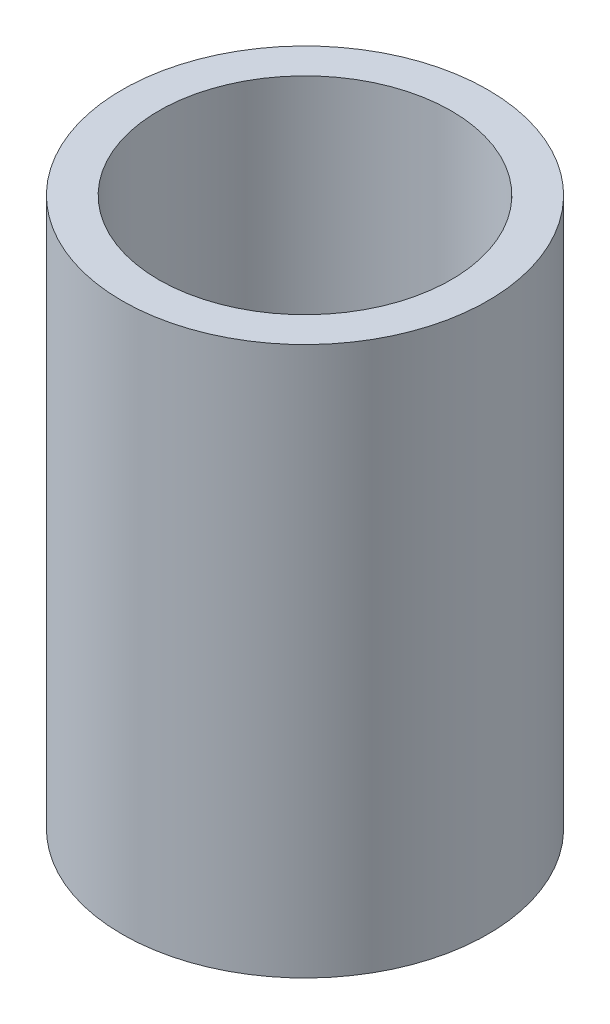
ISO-10303-21;
HEADER;
FILE_DESCRIPTION(('STEP AP214'),'2;1');
FILE_NAME('part.step','',(''),(''),'','','');
FILE_SCHEMA(('AUTOMOTIVE_DESIGN { 1 0 10303 214 1 1 1 1 }'));
ENDSEC;
DATA;
#1=APPLICATION_CONTEXT('core data for automotive mechanical design processes');
#2=APPLICATION_PROTOCOL_DEFINITION('international standard','automotive_design',2000,#1);
#3=PRODUCT_CONTEXT('',#1,'mechanical');
#4=PRODUCT('Part','Part','',(#3));
#5=PRODUCT_RELATED_PRODUCT_CATEGORY('part','',(#4));
#6=PRODUCT_DEFINITION_FORMATION('','',#4);
#7=PRODUCT_DEFINITION_CONTEXT('part definition',#1,'design');
#8=PRODUCT_DEFINITION('design','',#6,#7);
#9=PRODUCT_DEFINITION_SHAPE('','',#8);
#10=(LENGTH_UNIT() NAMED_UNIT(*) SI_UNIT(.MILLI.,.METRE.));
#11=(NAMED_UNIT(*) PLANE_ANGLE_UNIT() SI_UNIT($,.RADIAN.));
#12=(NAMED_UNIT(*) SI_UNIT($,.STERADIAN.) SOLID_ANGLE_UNIT());
#13=UNCERTAINTY_MEASURE_WITH_UNIT(LENGTH_MEASURE(1.E-05),#10,'distance_accuracy_value','');
#14=(GEOMETRIC_REPRESENTATION_CONTEXT(3) GLOBAL_UNCERTAINTY_ASSIGNED_CONTEXT((#13)) GLOBAL_UNIT_ASSIGNED_CONTEXT((#10,
#11,#12)) REPRESENTATION_CONTEXT('',''));
#15=CARTESIAN_POINT('',(0.,0.,0.));
#16=DIRECTION('',(0.,0.,1.));
#17=DIRECTION('',(1.,0.,0.));
#18=AXIS2_PLACEMENT_3D('',#15,#16,#17);
#19=CARTESIAN_POINT('',(0.,150.,0.));
#20=DIRECTION('',(0.,-1.,0.));
#21=DIRECTION('',(0.,0.,-1.));
#22=AXIS2_PLACEMENT_3D('',#19,#20,#21);
#23=CYLINDRICAL_SURFACE('',#22,40.);
#24=CARTESIAN_POINT('',(0.,150.,0.));
#25=DIRECTION('',(0.,1.,0.));
#26=DIRECTION('',(0.,0.,1.));
#27=AXIS2_PLACEMENT_3D('',#24,#25,#26);
#28=CIRCLE('',#27,40.);
#29=CARTESIAN_POINT('',(0.,150.,40.));
#30=VERTEX_POINT('',#29);
#31=EDGE_CURVE('E50',#30,#30,#28,.T.);
#32=ORIENTED_EDGE('',*,*,#31,.T.);
#33=EDGE_LOOP('',(#32));
#34=FACE_BOUND('',#33,.T.);
#35=CARTESIAN_POINT('',(0.,10.,0.));
#36=DIRECTION('',(0.,-1.,0.));
#37=DIRECTION('',(0.,0.,-1.));
#38=AXIS2_PLACEMENT_3D('',#35,#36,#37);
#39=CIRCLE('',#38,40.);
#40=CARTESIAN_POINT('',(0.,10.,-40.));
#41=VERTEX_POINT('',#40);
#42=EDGE_CURVE('E54',#41,#41,#39,.F.);
#43=ORIENTED_EDGE('',*,*,#42,.F.);
#44=EDGE_LOOP('',(#43));
#45=FACE_BOUND('',#44,.T.);
#46=ADVANCED_FACE('F39',(#34,#45),#23,.F.);
#47=CARTESIAN_POINT('',(0.,150.,0.));
#48=DIRECTION('',(0.,1.,0.));
#49=DIRECTION('',(0.,0.,1.));
#50=AXIS2_PLACEMENT_3D('',#47,#48,#49);
#51=PLANE('',#50);
#52=CARTESIAN_POINT('',(0.,150.,0.));
#53=DIRECTION('',(0.,1.,0.));
#54=DIRECTION('',(0.,0.,1.));
#55=AXIS2_PLACEMENT_3D('',#52,#53,#54);
#56=CIRCLE('',#55,50.);
#57=CARTESIAN_POINT('',(0.,150.,50.));
#58=VERTEX_POINT('',#57);
#59=EDGE_CURVE('E10',#58,#58,#56,.T.);
#60=ORIENTED_EDGE('',*,*,#59,.T.);
#61=EDGE_LOOP('',(#60));
#62=FACE_BOUND('',#61,.T.);
#63=ORIENTED_EDGE('',*,*,#31,.F.);
#64=EDGE_LOOP('',(#63));
#65=FACE_BOUND('',#64,.T.);
#66=ADVANCED_FACE('F75',(#62,#65),#51,.T.);
#67=CARTESIAN_POINT('',(0.,0.,0.));
#68=DIRECTION('',(0.,1.,0.));
#69=DIRECTION('',(0.,0.,1.));
#70=AXIS2_PLACEMENT_3D('',#67,#68,#69);
#71=PLANE('',#70);
#72=CARTESIAN_POINT('',(0.,0.,0.));
#73=DIRECTION('',(0.,1.,0.));
#74=DIRECTION('',(0.,0.,1.));
#75=AXIS2_PLACEMENT_3D('',#72,#73,#74);
#76=CIRCLE('',#75,50.);
#77=CARTESIAN_POINT('',(0.,0.,50.));
#78=VERTEX_POINT('',#77);
#79=EDGE_CURVE('E43',#78,#78,#76,.T.);
#80=ORIENTED_EDGE('',*,*,#79,.F.);
#81=EDGE_LOOP('',(#80));
#82=FACE_BOUND('',#81,.T.);
#83=CARTESIAN_POINT('',(0.,0.,0.));
#84=DIRECTION('',(0.,-1.,0.));
#85=DIRECTION('',(0.,0.,-1.));
#86=AXIS2_PLACEMENT_3D('',#83,#84,#85);
#87=CIRCLE('',#86,30.);
#88=CARTESIAN_POINT('',(0.,0.,-30.));
#89=VERTEX_POINT('',#88);
#90=EDGE_CURVE('E55',#89,#89,#87,.T.);
#91=ORIENTED_EDGE('',*,*,#90,.F.);
#92=EDGE_LOOP('',(#91));
#93=FACE_BOUND('',#92,.T.);
#94=ADVANCED_FACE('F73',(#82,#93),#71,.F.);
#95=CARTESIAN_POINT('',(0.,150.,0.));
#96=DIRECTION('',(0.,-1.,0.));
#97=DIRECTION('',(0.,0.,-1.));
#98=AXIS2_PLACEMENT_3D('',#95,#96,#97);
#99=CYLINDRICAL_SURFACE('',#98,50.);
#100=ORIENTED_EDGE('',*,*,#59,.F.);
#101=EDGE_LOOP('',(#100));
#102=FACE_BOUND('',#101,.T.);
#103=ORIENTED_EDGE('',*,*,#79,.T.);
#104=EDGE_LOOP('',(#103));
#105=FACE_BOUND('',#104,.T.);
#106=ADVANCED_FACE('F41',(#102,#105),#99,.T.);
#107=CARTESIAN_POINT('',(0.,10.,0.));
#108=DIRECTION('',(0.,-1.,0.));
#109=DIRECTION('',(0.,0.,-1.));
#110=AXIS2_PLACEMENT_3D('',#107,#108,#109);
#111=CYLINDRICAL_SURFACE('',#110,30.);
#112=CARTESIAN_POINT('',(0.,10.,0.));
#113=DIRECTION('',(0.,-1.,0.));
#114=DIRECTION('',(0.,0.,-1.));
#115=AXIS2_PLACEMENT_3D('',#112,#113,#114);
#116=CIRCLE('',#115,30.);
#117=CARTESIAN_POINT('',(0.,10.,-30.));
#118=VERTEX_POINT('',#117);
#119=EDGE_CURVE('E58',#118,#118,#116,.T.);
#120=ORIENTED_EDGE('',*,*,#119,.F.);
#121=EDGE_LOOP('',(#120));
#122=FACE_BOUND('',#121,.T.);
#123=ORIENTED_EDGE('',*,*,#90,.T.);
#124=EDGE_LOOP('',(#123));
#125=FACE_BOUND('',#124,.T.);
#126=ADVANCED_FACE('F67',(#122,#125),#111,.F.);
#127=CARTESIAN_POINT('',(0.,10.,0.));
#128=DIRECTION('',(0.,-1.,0.));
#129=DIRECTION('',(0.,0.,-1.));
#130=AXIS2_PLACEMENT_3D('',#127,#128,#129);
#131=PLANE('',#130);
#132=ORIENTED_EDGE('',*,*,#119,.T.);
#133=EDGE_LOOP('',(#132));
#134=FACE_BOUND('',#133,.T.);
#135=ORIENTED_EDGE('',*,*,#42,.T.);
#136=EDGE_LOOP('',(#135));
#137=FACE_BOUND('',#136,.T.);
#138=ADVANCED_FACE('F64',(#134,#137),#131,.F.);
#139=CLOSED_SHELL('',(#46,#66,#94,#106,#126,#138));
#140=MANIFOLD_SOLID_BREP('B2',#139);
#141=ADVANCED_BREP_SHAPE_REPRESENTATION('',(#18,#140),#14);
#142=SHAPE_DEFINITION_REPRESENTATION(#9,#141);
ENDSEC;
END-ISO-10303-21;
